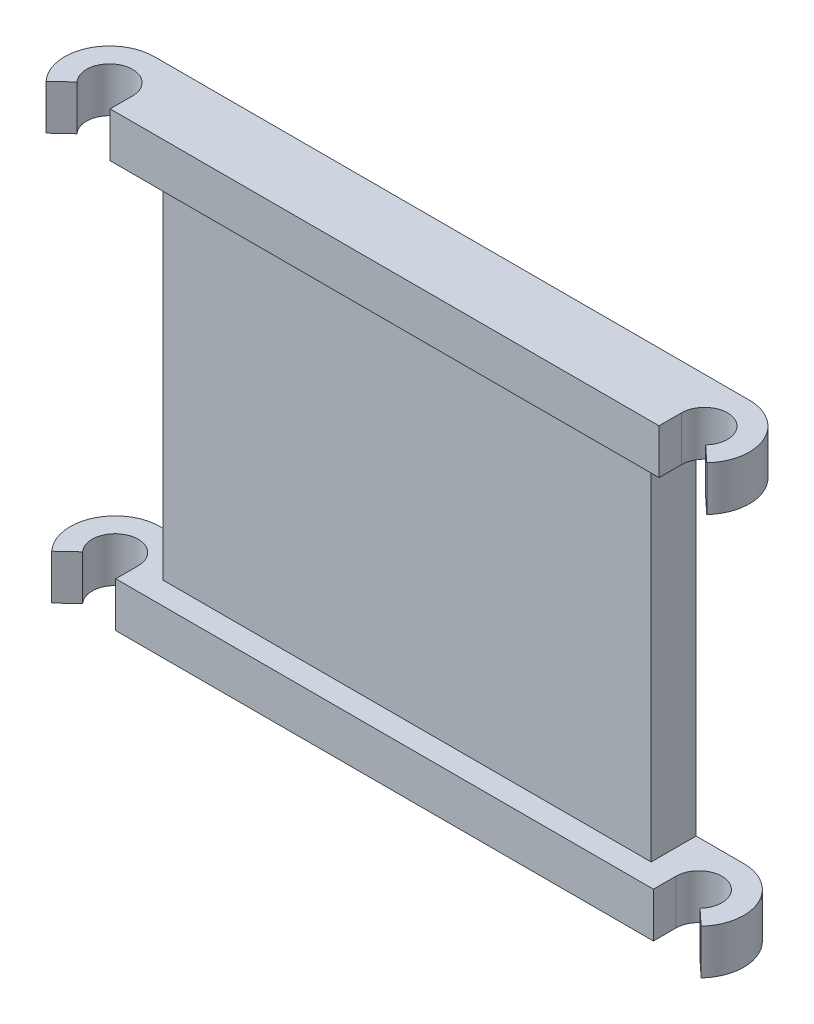
ISO-10303-21;
HEADER;
FILE_DESCRIPTION(('STEP AP214'),'2;1');
FILE_NAME('part.step','',(''),(''),'','','');
FILE_SCHEMA(('AUTOMOTIVE_DESIGN { 1 0 10303 214 1 1 1 1 }'));
ENDSEC;
DATA;
#1=APPLICATION_CONTEXT('core data for automotive mechanical design processes');
#2=APPLICATION_PROTOCOL_DEFINITION('international standard','automotive_design',2000,#1);
#3=PRODUCT_CONTEXT('',#1,'mechanical');
#4=PRODUCT('Part','Part','',(#3));
#5=PRODUCT_RELATED_PRODUCT_CATEGORY('part','',(#4));
#6=PRODUCT_DEFINITION_FORMATION('','',#4);
#7=PRODUCT_DEFINITION_CONTEXT('part definition',#1,'design');
#8=PRODUCT_DEFINITION('design','',#6,#7);
#9=PRODUCT_DEFINITION_SHAPE('','',#8);
#10=(LENGTH_UNIT() NAMED_UNIT(*) SI_UNIT(.MILLI.,.METRE.));
#11=(NAMED_UNIT(*) PLANE_ANGLE_UNIT() SI_UNIT($,.RADIAN.));
#12=(NAMED_UNIT(*) SI_UNIT($,.STERADIAN.) SOLID_ANGLE_UNIT());
#13=UNCERTAINTY_MEASURE_WITH_UNIT(LENGTH_MEASURE(1.E-05),#10,'distance_accuracy_value','');
#14=(GEOMETRIC_REPRESENTATION_CONTEXT(3) GLOBAL_UNCERTAINTY_ASSIGNED_CONTEXT((#13)) GLOBAL_UNIT_ASSIGNED_CONTEXT((#10,
#11,#12)) REPRESENTATION_CONTEXT('',''));
#15=CARTESIAN_POINT('',(0.,0.,0.));
#16=DIRECTION('',(0.,0.,1.));
#17=DIRECTION('',(1.,0.,0.));
#18=AXIS2_PLACEMENT_3D('',#15,#16,#17);
#19=CARTESIAN_POINT('',(52.,-32.,0.));
#20=DIRECTION('',(0.,-1.,0.));
#21=DIRECTION('',(0.,0.,-1.));
#22=AXIS2_PLACEMENT_3D('',#19,#20,#21);
#23=PLANE('',#22);
#24=DIRECTION('',(0.,0.,-1.));
#25=VECTOR('',#24,1.);
#26=CARTESIAN_POINT('',(43.5,-32.,0.));
#27=LINE('',#26,#25);
#28=CARTESIAN_POINT('',(43.5,-32.,0.));
#29=VERTEX_POINT('',#28);
#30=CARTESIAN_POINT('',(43.5,-32.,-8.));
#31=VERTEX_POINT('',#30);
#32=EDGE_CURVE('E338',#29,#31,#27,.T.);
#33=ORIENTED_EDGE('',*,*,#32,.F.);
#34=DIRECTION('',(-1.,0.,0.));
#35=VECTOR('',#34,1.);
#36=CARTESIAN_POINT('',(0.,-32.,0.));
#37=LINE('',#36,#35);
#38=CARTESIAN_POINT('',(-43.5,-32.,0.));
#39=VERTEX_POINT('',#38);
#40=EDGE_CURVE('E333',#29,#39,#37,.T.);
#41=ORIENTED_EDGE('',*,*,#40,.T.);
#42=DIRECTION('',(0.,0.,-1.));
#43=VECTOR('',#42,1.);
#44=CARTESIAN_POINT('',(-43.5,-32.,0.));
#45=LINE('',#44,#43);
#46=CARTESIAN_POINT('',(-43.5,-32.,-7.99999999999999));
#47=VERTEX_POINT('',#46);
#48=EDGE_CURVE('E243',#39,#47,#45,.T.);
#49=ORIENTED_EDGE('',*,*,#48,.T.);
#50=DIRECTION('',(1.,0.,0.));
#51=VECTOR('',#50,1.);
#52=CARTESIAN_POINT('',(-52.,-32.,-7.99999999999999));
#53=LINE('',#52,#51);
#54=CARTESIAN_POINT('',(-52.,-32.,-7.99999999999999));
#55=VERTEX_POINT('',#54);
#56=EDGE_CURVE('E256',#55,#47,#53,.T.);
#57=ORIENTED_EDGE('',*,*,#56,.F.);
#58=CARTESIAN_POINT('',(-52.,-32.,0.));
#59=DIRECTION('',(0.,-1.,0.));
#60=DIRECTION('',(0.,0.,1.));
#61=AXIS2_PLACEMENT_3D('',#58,#59,#60);
#62=CIRCLE('',#61,8.);
#63=CARTESIAN_POINT('',(-57.8536585365854,-32.,5.45295165365156));
#64=VERTEX_POINT('',#63);
#65=EDGE_CURVE('E253',#64,#55,#62,.T.);
#66=ORIENTED_EDGE('',*,*,#65,.F.);
#67=DIRECTION('',(-0.731707317073171,0.,0.681618956706444));
#68=VECTOR('',#67,1.);
#69=CARTESIAN_POINT('',(-55.,-32.,2.79463772249643));
#70=LINE('',#69,#68);
#71=CARTESIAN_POINT('',(-55.,-32.,2.79463772249643));
#72=VERTEX_POINT('',#71);
#73=EDGE_CURVE('E250',#72,#64,#70,.T.);
#74=ORIENTED_EDGE('',*,*,#73,.F.);
#75=CARTESIAN_POINT('',(-52.,-32.,0.));
#76=DIRECTION('',(0.,1.,0.));
#77=DIRECTION('',(0.,0.,-1.));
#78=AXIS2_PLACEMENT_3D('',#75,#76,#77);
#79=CIRCLE('',#78,4.1);
#80=CARTESIAN_POINT('',(-47.9,-32.,0.));
#81=VERTEX_POINT('',#80);
#82=EDGE_CURVE('E246',#81,#72,#79,.T.);
#83=ORIENTED_EDGE('',*,*,#82,.F.);
#84=DIRECTION('',(0.,0.,-1.));
#85=VECTOR('',#84,1.);
#86=CARTESIAN_POINT('',(-47.9,-32.,4.00000000000001));
#87=LINE('',#86,#85);
#88=CARTESIAN_POINT('',(-47.9,-32.,4.00000000000001));
#89=VERTEX_POINT('',#88);
#90=EDGE_CURVE('E259',#89,#81,#87,.T.);
#91=ORIENTED_EDGE('',*,*,#90,.F.);
#92=DIRECTION('',(1.,0.,0.));
#93=VECTOR('',#92,1.);
#94=CARTESIAN_POINT('',(0.,-32.,4.));
#95=LINE('',#94,#93);
#96=CARTESIAN_POINT('',(47.9,-32.,4.));
#97=VERTEX_POINT('',#96);
#98=EDGE_CURVE('E354',#89,#97,#95,.T.);
#99=ORIENTED_EDGE('',*,*,#98,.T.);
#100=DIRECTION('',(0.,0.,-1.));
#101=VECTOR('',#100,1.);
#102=CARTESIAN_POINT('',(47.9,-32.,4.));
#103=LINE('',#102,#101);
#104=CARTESIAN_POINT('',(47.9,-32.,0.));
#105=VERTEX_POINT('',#104);
#106=EDGE_CURVE('E357',#97,#105,#103,.T.);
#107=ORIENTED_EDGE('',*,*,#106,.T.);
#108=CARTESIAN_POINT('',(52.,-32.,0.));
#109=DIRECTION('',(0.,-1.,0.));
#110=DIRECTION('',(0.,0.,-1.));
#111=AXIS2_PLACEMENT_3D('',#108,#109,#110);
#112=CIRCLE('',#111,4.1);
#113=CARTESIAN_POINT('',(55.,-32.,2.79463772249642));
#114=VERTEX_POINT('',#113);
#115=EDGE_CURVE('E340',#105,#114,#112,.T.);
#116=ORIENTED_EDGE('',*,*,#115,.T.);
#117=DIRECTION('',(0.731707317073171,0.,0.681618956706444));
#118=VECTOR('',#117,1.);
#119=CARTESIAN_POINT('',(55.,-32.,2.79463772249642));
#120=LINE('',#119,#118);
#121=CARTESIAN_POINT('',(57.8536585365854,-32.,5.45295165365155));
#122=VERTEX_POINT('',#121);
#123=EDGE_CURVE('E345',#114,#122,#120,.T.);
#124=ORIENTED_EDGE('',*,*,#123,.T.);
#125=CARTESIAN_POINT('',(52.,-32.,0.));
#126=DIRECTION('',(0.,1.,0.));
#127=DIRECTION('',(0.,0.,1.));
#128=AXIS2_PLACEMENT_3D('',#125,#126,#127);
#129=CIRCLE('',#128,8.);
#130=CARTESIAN_POINT('',(52.,-32.,-8.));
#131=VERTEX_POINT('',#130);
#132=EDGE_CURVE('E348',#122,#131,#129,.T.);
#133=ORIENTED_EDGE('',*,*,#132,.T.);
#134=DIRECTION('',(-1.,0.,0.));
#135=VECTOR('',#134,1.);
#136=CARTESIAN_POINT('',(52.,-32.,-8.));
#137=LINE('',#136,#135);
#138=EDGE_CURVE('E351',#131,#31,#137,.T.);
#139=ORIENTED_EDGE('',*,*,#138,.T.);
#140=EDGE_LOOP('',(#33,#41,#49,#57,#66,#74,#83,#91,#99,#107,#116,#124,#133,#139));
#141=FACE_BOUND('',#140,.T.);
#142=ADVANCED_FACE('F41',(#141),#23,.F.);
#143=CARTESIAN_POINT('',(52.,-40.,0.));
#144=DIRECTION('',(0.,1.,0.));
#145=DIRECTION('',(0.,0.,1.));
#146=AXIS2_PLACEMENT_3D('',#143,#144,#145);
#147=CYLINDRICAL_SURFACE('',#146,4.1);
#148=DIRECTION('',(0.,1.,0.));
#149=VECTOR('',#148,1.);
#150=CARTESIAN_POINT('',(55.,-40.,2.79463772249642));
#151=LINE('',#150,#149);
#152=CARTESIAN_POINT('',(55.,-40.,2.79463772249642));
#153=VERTEX_POINT('',#152);
#154=EDGE_CURVE('E45',#153,#114,#151,.T.);
#155=ORIENTED_EDGE('',*,*,#154,.T.);
#156=ORIENTED_EDGE('',*,*,#115,.F.);
#157=DIRECTION('',(0.,1.,0.));
#158=VECTOR('',#157,1.);
#159=CARTESIAN_POINT('',(47.9,-40.,0.));
#160=LINE('',#159,#158);
#161=CARTESIAN_POINT('',(47.9,-40.,0.));
#162=VERTEX_POINT('',#161);
#163=EDGE_CURVE('E11',#162,#105,#160,.T.);
#164=ORIENTED_EDGE('',*,*,#163,.F.);
#165=CARTESIAN_POINT('',(52.,-40.,0.));
#166=DIRECTION('',(0.,-1.,0.));
#167=DIRECTION('',(0.,0.,-1.));
#168=AXIS2_PLACEMENT_3D('',#165,#166,#167);
#169=CIRCLE('',#168,4.1);
#170=EDGE_CURVE('E360',#162,#153,#169,.T.);
#171=ORIENTED_EDGE('',*,*,#170,.T.);
#172=EDGE_LOOP('',(#155,#156,#164,#171));
#173=FACE_BOUND('',#172,.T.);
#174=ADVANCED_FACE('F43',(#173),#147,.F.);
#175=CARTESIAN_POINT('',(47.9,-40.,4.));
#176=DIRECTION('',(1.,0.,0.));
#177=DIRECTION('',(0.,0.,-1.));
#178=AXIS2_PLACEMENT_3D('',#175,#176,#177);
#179=PLANE('',#178);
#180=ORIENTED_EDGE('',*,*,#163,.T.);
#181=ORIENTED_EDGE('',*,*,#106,.F.);
#182=DIRECTION('',(0.,1.,0.));
#183=VECTOR('',#182,1.);
#184=CARTESIAN_POINT('',(47.9,-40.,4.));
#185=LINE('',#184,#183);
#186=CARTESIAN_POINT('',(47.9,-40.,4.));
#187=VERTEX_POINT('',#186);
#188=EDGE_CURVE('E50',#187,#97,#185,.T.);
#189=ORIENTED_EDGE('',*,*,#188,.F.);
#190=DIRECTION('',(0.,0.,-1.));
#191=VECTOR('',#190,1.);
#192=CARTESIAN_POINT('',(47.9,-40.,4.));
#193=LINE('',#192,#191);
#194=EDGE_CURVE('E372',#187,#162,#193,.T.);
#195=ORIENTED_EDGE('',*,*,#194,.T.);
#196=EDGE_LOOP('',(#180,#181,#189,#195));
#197=FACE_BOUND('',#196,.T.);
#198=ADVANCED_FACE('F385',(#197),#179,.T.);
#199=CARTESIAN_POINT('',(0.,-40.,4.));
#200=DIRECTION('',(0.,0.,1.));
#201=DIRECTION('',(1.,0.,0.));
#202=AXIS2_PLACEMENT_3D('',#199,#200,#201);
#203=PLANE('',#202);
#204=ORIENTED_EDGE('',*,*,#188,.T.);
#205=ORIENTED_EDGE('',*,*,#98,.F.);
#206=DIRECTION('',(0.,1.,0.));
#207=VECTOR('',#206,1.);
#208=CARTESIAN_POINT('',(-47.9,-40.,4.00000000000001));
#209=LINE('',#208,#207);
#210=CARTESIAN_POINT('',(-47.9,-40.,4.00000000000001));
#211=VERTEX_POINT('',#210);
#212=EDGE_CURVE('E276',#211,#89,#209,.T.);
#213=ORIENTED_EDGE('',*,*,#212,.F.);
#214=DIRECTION('',(1.,0.,0.));
#215=VECTOR('',#214,1.);
#216=CARTESIAN_POINT('',(0.,-40.,4.));
#217=LINE('',#216,#215);
#218=EDGE_CURVE('E370',#211,#187,#217,.T.);
#219=ORIENTED_EDGE('',*,*,#218,.T.);
#220=EDGE_LOOP('',(#204,#205,#213,#219));
#221=FACE_BOUND('',#220,.T.);
#222=ADVANCED_FACE('F435',(#221),#203,.T.);
#223=CARTESIAN_POINT('',(52.,-40.,-8.));
#224=DIRECTION('',(0.,0.,-1.));
#225=DIRECTION('',(-1.,0.,0.));
#226=AXIS2_PLACEMENT_3D('',#223,#224,#225);
#227=PLANE('',#226);
#228=DIRECTION('',(-1.,0.,0.));
#229=VECTOR('',#228,1.);
#230=CARTESIAN_POINT('',(52.,-40.,-8.));
#231=LINE('',#230,#229);
#232=CARTESIAN_POINT('',(52.,-40.,-8.));
#233=VERTEX_POINT('',#232);
#234=CARTESIAN_POINT('',(-52.,-40.,-7.99999999999999));
#235=VERTEX_POINT('',#234);
#236=EDGE_CURVE('E368',#233,#235,#231,.T.);
#237=ORIENTED_EDGE('',*,*,#236,.T.);
#238=DIRECTION('',(0.,1.,0.));
#239=VECTOR('',#238,1.);
#240=CARTESIAN_POINT('',(-52.,-40.,-7.99999999999999));
#241=LINE('',#240,#239);
#242=EDGE_CURVE('E279',#235,#55,#241,.T.);
#243=ORIENTED_EDGE('',*,*,#242,.T.);
#244=ORIENTED_EDGE('',*,*,#56,.T.);
#245=DIRECTION('',(0.,-1.,0.));
#246=VECTOR('',#245,1.);
#247=CARTESIAN_POINT('',(-43.5,-32.,-7.99999999999999));
#248=LINE('',#247,#246);
#249=CARTESIAN_POINT('',(-43.5,32.,-7.99999999999999));
#250=VERTEX_POINT('',#249);
#251=EDGE_CURVE('E241',#250,#47,#248,.T.);
#252=ORIENTED_EDGE('',*,*,#251,.F.);
#253=DIRECTION('',(1.,0.,0.));
#254=VECTOR('',#253,1.);
#255=CARTESIAN_POINT('',(-53.,32.,-7.99999999999999));
#256=LINE('',#255,#254);
#257=CARTESIAN_POINT('',(-53.,32.,-7.99999999999999));
#258=VERTEX_POINT('',#257);
#259=EDGE_CURVE('E233',#258,#250,#256,.T.);
#260=ORIENTED_EDGE('',*,*,#259,.F.);
#261=DIRECTION('',(0.,1.,0.));
#262=VECTOR('',#261,1.);
#263=CARTESIAN_POINT('',(-53.,32.,-7.99999999999999));
#264=LINE('',#263,#262);
#265=CARTESIAN_POINT('',(-53.,40.,-7.99999999999999));
#266=VERTEX_POINT('',#265);
#267=EDGE_CURVE('E231',#258,#266,#264,.T.);
#268=ORIENTED_EDGE('',*,*,#267,.T.);
#269=DIRECTION('',(-1.,0.,0.));
#270=VECTOR('',#269,1.);
#271=CARTESIAN_POINT('',(53.,40.,-8.));
#272=LINE('',#271,#270);
#273=CARTESIAN_POINT('',(53.,40.,-8.));
#274=VERTEX_POINT('',#273);
#275=EDGE_CURVE('E291',#274,#266,#272,.T.);
#276=ORIENTED_EDGE('',*,*,#275,.F.);
#277=DIRECTION('',(0.,1.,0.));
#278=VECTOR('',#277,1.);
#279=CARTESIAN_POINT('',(53.,32.,-8.));
#280=LINE('',#279,#278);
#281=CARTESIAN_POINT('',(53.,32.,-8.));
#282=VERTEX_POINT('',#281);
#283=EDGE_CURVE('E323',#282,#274,#280,.T.);
#284=ORIENTED_EDGE('',*,*,#283,.F.);
#285=DIRECTION('',(-1.,0.,0.));
#286=VECTOR('',#285,1.);
#287=CARTESIAN_POINT('',(53.,32.,-8.));
#288=LINE('',#287,#286);
#289=CARTESIAN_POINT('',(43.5,32.,-8.));
#290=VERTEX_POINT('',#289);
#291=EDGE_CURVE('E308',#282,#290,#288,.T.);
#292=ORIENTED_EDGE('',*,*,#291,.T.);
#293=DIRECTION('',(0.,-1.,0.));
#294=VECTOR('',#293,1.);
#295=CARTESIAN_POINT('',(43.5,-32.,-8.));
#296=LINE('',#295,#294);
#297=EDGE_CURVE('E320',#290,#31,#296,.T.);
#298=ORIENTED_EDGE('',*,*,#297,.T.);
#299=ORIENTED_EDGE('',*,*,#138,.F.);
#300=DIRECTION('',(0.,1.,0.));
#301=VECTOR('',#300,1.);
#302=CARTESIAN_POINT('',(52.,-40.,-8.));
#303=LINE('',#302,#301);
#304=EDGE_CURVE('E375',#233,#131,#303,.T.);
#305=ORIENTED_EDGE('',*,*,#304,.F.);
#306=EDGE_LOOP('',(#237,#243,#244,#252,#260,#268,#276,#284,#292,#298,#299,#305));
#307=FACE_BOUND('',#306,.T.);
#308=ADVANCED_FACE('F396',(#307),#227,.T.);
#309=CARTESIAN_POINT('',(52.,-40.,0.));
#310=DIRECTION('',(0.,1.,0.));
#311=DIRECTION('',(0.,0.,1.));
#312=AXIS2_PLACEMENT_3D('',#309,#310,#311);
#313=CYLINDRICAL_SURFACE('',#312,8.);
#314=ORIENTED_EDGE('',*,*,#304,.T.);
#315=ORIENTED_EDGE('',*,*,#132,.F.);
#316=DIRECTION('',(0.,1.,0.));
#317=VECTOR('',#316,1.);
#318=CARTESIAN_POINT('',(57.8536585365854,-40.,5.45295165365155));
#319=LINE('',#318,#317);
#320=CARTESIAN_POINT('',(57.8536585365854,-40.,5.45295165365155));
#321=VERTEX_POINT('',#320);
#322=EDGE_CURVE('E376',#321,#122,#319,.T.);
#323=ORIENTED_EDGE('',*,*,#322,.F.);
#324=CARTESIAN_POINT('',(52.,-40.,0.));
#325=DIRECTION('',(0.,1.,0.));
#326=DIRECTION('',(0.,0.,1.));
#327=AXIS2_PLACEMENT_3D('',#324,#325,#326);
#328=CIRCLE('',#327,8.);
#329=EDGE_CURVE('E365',#321,#233,#328,.T.);
#330=ORIENTED_EDGE('',*,*,#329,.T.);
#331=EDGE_LOOP('',(#314,#315,#323,#330));
#332=FACE_BOUND('',#331,.T.);
#333=ADVANCED_FACE('F393',(#332),#313,.T.);
#334=CARTESIAN_POINT('',(55.,-40.,2.79463772249642));
#335=DIRECTION('',(-0.681618956706444,0.,0.731707317073171));
#336=DIRECTION('',(0.731707317073171,0.,0.681618956706444));
#337=AXIS2_PLACEMENT_3D('',#334,#335,#336);
#338=PLANE('',#337);
#339=ORIENTED_EDGE('',*,*,#322,.T.);
#340=ORIENTED_EDGE('',*,*,#123,.F.);
#341=ORIENTED_EDGE('',*,*,#154,.F.);
#342=DIRECTION('',(0.731707317073171,0.,0.681618956706444));
#343=VECTOR('',#342,1.);
#344=CARTESIAN_POINT('',(55.,-40.,2.79463772249642));
#345=LINE('',#344,#343);
#346=EDGE_CURVE('E362',#153,#321,#345,.T.);
#347=ORIENTED_EDGE('',*,*,#346,.T.);
#348=EDGE_LOOP('',(#339,#340,#341,#347));
#349=FACE_BOUND('',#348,.T.);
#350=ADVANCED_FACE('F380',(#349),#338,.T.);
#351=CARTESIAN_POINT('',(52.,-40.,0.));
#352=DIRECTION('',(0.,-1.,0.));
#353=DIRECTION('',(0.,0.,-1.));
#354=AXIS2_PLACEMENT_3D('',#351,#352,#353);
#355=PLANE('',#354);
#356=ORIENTED_EDGE('',*,*,#170,.F.);
#357=ORIENTED_EDGE('',*,*,#194,.F.);
#358=ORIENTED_EDGE('',*,*,#218,.F.);
#359=DIRECTION('',(0.,0.,-1.));
#360=VECTOR('',#359,1.);
#361=CARTESIAN_POINT('',(-47.9,-40.,4.00000000000001));
#362=LINE('',#361,#360);
#363=CARTESIAN_POINT('',(-47.9,-40.,0.));
#364=VERTEX_POINT('',#363);
#365=EDGE_CURVE('E270',#211,#364,#362,.T.);
#366=ORIENTED_EDGE('',*,*,#365,.T.);
#367=CARTESIAN_POINT('',(-52.,-40.,0.));
#368=DIRECTION('',(0.,1.,0.));
#369=DIRECTION('',(0.,0.,-1.));
#370=AXIS2_PLACEMENT_3D('',#367,#368,#369);
#371=CIRCLE('',#370,4.1);
#372=CARTESIAN_POINT('',(-55.,-40.,2.79463772249643));
#373=VERTEX_POINT('',#372);
#374=EDGE_CURVE('E262',#364,#373,#371,.T.);
#375=ORIENTED_EDGE('',*,*,#374,.T.);
#376=DIRECTION('',(-0.731707317073171,0.,0.681618956706444));
#377=VECTOR('',#376,1.);
#378=CARTESIAN_POINT('',(-55.,-40.,2.79463772249643));
#379=LINE('',#378,#377);
#380=CARTESIAN_POINT('',(-57.8536585365854,-40.,5.45295165365156));
#381=VERTEX_POINT('',#380);
#382=EDGE_CURVE('E265',#373,#381,#379,.T.);
#383=ORIENTED_EDGE('',*,*,#382,.T.);
#384=CARTESIAN_POINT('',(-52.,-40.,0.));
#385=DIRECTION('',(0.,-1.,0.));
#386=DIRECTION('',(0.,0.,1.));
#387=AXIS2_PLACEMENT_3D('',#384,#385,#386);
#388=CIRCLE('',#387,8.);
#389=EDGE_CURVE('E267',#381,#235,#388,.T.);
#390=ORIENTED_EDGE('',*,*,#389,.T.);
#391=ORIENTED_EDGE('',*,*,#236,.F.);
#392=ORIENTED_EDGE('',*,*,#329,.F.);
#393=ORIENTED_EDGE('',*,*,#346,.F.);
#394=EDGE_LOOP('',(#356,#357,#358,#366,#375,#383,#390,#391,#392,#393));
#395=FACE_BOUND('',#394,.T.);
#396=ADVANCED_FACE('F388',(#395),#355,.T.);
#397=CARTESIAN_POINT('',(43.5,-32.,0.));
#398=DIRECTION('',(1.,0.,0.));
#399=DIRECTION('',(0.,0.,-1.));
#400=AXIS2_PLACEMENT_3D('',#397,#398,#399);
#401=PLANE('',#400);
#402=ORIENTED_EDGE('',*,*,#297,.F.);
#403=DIRECTION('',(0.,0.,-1.));
#404=VECTOR('',#403,1.);
#405=CARTESIAN_POINT('',(43.5,32.,0.));
#406=LINE('',#405,#404);
#407=CARTESIAN_POINT('',(43.5,32.,0.));
#408=VERTEX_POINT('',#407);
#409=EDGE_CURVE('E335',#408,#290,#406,.T.);
#410=ORIENTED_EDGE('',*,*,#409,.F.);
#411=DIRECTION('',(0.,-1.,0.));
#412=VECTOR('',#411,1.);
#413=CARTESIAN_POINT('',(43.5,-32.,0.));
#414=LINE('',#413,#412);
#415=EDGE_CURVE('E331',#408,#29,#414,.T.);
#416=ORIENTED_EDGE('',*,*,#415,.T.);
#417=ORIENTED_EDGE('',*,*,#32,.T.);
#418=EDGE_LOOP('',(#402,#410,#416,#417));
#419=FACE_BOUND('',#418,.T.);
#420=ADVANCED_FACE('F399',(#419),#401,.T.);
#421=CARTESIAN_POINT('',(0.,0.,0.));
#422=DIRECTION('',(0.,0.,1.));
#423=DIRECTION('',(1.,0.,0.));
#424=AXIS2_PLACEMENT_3D('',#421,#422,#423);
#425=PLANE('',#424);
#426=DIRECTION('',(1.,0.,0.));
#427=VECTOR('',#426,1.);
#428=CARTESIAN_POINT('',(43.5,32.,0.));
#429=LINE('',#428,#427);
#430=CARTESIAN_POINT('',(-43.5,32.,0.));
#431=VERTEX_POINT('',#430);
#432=EDGE_CURVE('E328',#431,#408,#429,.T.);
#433=ORIENTED_EDGE('',*,*,#432,.F.);
#434=DIRECTION('',(0.,-1.,0.));
#435=VECTOR('',#434,1.);
#436=CARTESIAN_POINT('',(-43.5,-32.,0.));
#437=LINE('',#436,#435);
#438=EDGE_CURVE('E237',#431,#39,#437,.T.);
#439=ORIENTED_EDGE('',*,*,#438,.T.);
#440=ORIENTED_EDGE('',*,*,#40,.F.);
#441=ORIENTED_EDGE('',*,*,#415,.F.);
#442=EDGE_LOOP('',(#433,#439,#440,#441));
#443=FACE_BOUND('',#442,.T.);
#444=ADVANCED_FACE('F408',(#443),#425,.T.);
#445=CARTESIAN_POINT('',(53.,32.,0.));
#446=DIRECTION('',(0.,1.,0.));
#447=DIRECTION('',(0.,0.,1.));
#448=AXIS2_PLACEMENT_3D('',#445,#446,#447);
#449=CYLINDRICAL_SURFACE('',#448,4.1);
#450=DIRECTION('',(0.,1.,0.));
#451=VECTOR('',#450,1.);
#452=CARTESIAN_POINT('',(56.,32.,2.79463772249642));
#453=LINE('',#452,#451);
#454=CARTESIAN_POINT('',(56.,32.,2.79463772249642));
#455=VERTEX_POINT('',#454);
#456=CARTESIAN_POINT('',(56.,40.,2.79463772249642));
#457=VERTEX_POINT('',#456);
#458=EDGE_CURVE('E317',#455,#457,#453,.T.);
#459=ORIENTED_EDGE('',*,*,#458,.T.);
#460=CARTESIAN_POINT('',(53.,40.,0.));
#461=DIRECTION('',(0.,-1.,0.));
#462=DIRECTION('',(0.,0.,-1.));
#463=AXIS2_PLACEMENT_3D('',#460,#461,#462);
#464=CIRCLE('',#463,4.1);
#465=CARTESIAN_POINT('',(48.9,40.,0.));
#466=VERTEX_POINT('',#465);
#467=EDGE_CURVE('E275',#466,#457,#464,.T.);
#468=ORIENTED_EDGE('',*,*,#467,.F.);
#469=DIRECTION('',(0.,1.,0.));
#470=VECTOR('',#469,1.);
#471=CARTESIAN_POINT('',(48.9,32.,0.));
#472=LINE('',#471,#470);
#473=CARTESIAN_POINT('',(48.9,32.,0.));
#474=VERTEX_POINT('',#473);
#475=EDGE_CURVE('E318',#474,#466,#472,.T.);
#476=ORIENTED_EDGE('',*,*,#475,.F.);
#477=CARTESIAN_POINT('',(53.,32.,0.));
#478=DIRECTION('',(0.,-1.,0.));
#479=DIRECTION('',(0.,0.,-1.));
#480=AXIS2_PLACEMENT_3D('',#477,#478,#479);
#481=CIRCLE('',#480,4.1);
#482=EDGE_CURVE('E299',#474,#455,#481,.T.);
#483=ORIENTED_EDGE('',*,*,#482,.T.);
#484=EDGE_LOOP('',(#459,#468,#476,#483));
#485=FACE_BOUND('',#484,.T.);
#486=ADVANCED_FACE('F505',(#485),#449,.F.);
#487=CARTESIAN_POINT('',(48.9,32.,0.));
#488=DIRECTION('',(1.,0.,0.));
#489=DIRECTION('',(0.,0.,-1.));
#490=AXIS2_PLACEMENT_3D('',#487,#488,#489);
#491=PLANE('',#490);
#492=ORIENTED_EDGE('',*,*,#475,.T.);
#493=DIRECTION('',(0.,0.,-1.));
#494=VECTOR('',#493,1.);
#495=CARTESIAN_POINT('',(48.9,40.,0.));
#496=LINE('',#495,#494);
#497=CARTESIAN_POINT('',(48.9,40.,4.));
#498=VERTEX_POINT('',#497);
#499=EDGE_CURVE('E296',#498,#466,#496,.T.);
#500=ORIENTED_EDGE('',*,*,#499,.F.);
#501=DIRECTION('',(0.,1.,0.));
#502=VECTOR('',#501,1.);
#503=CARTESIAN_POINT('',(48.9,32.,4.));
#504=LINE('',#503,#502);
#505=CARTESIAN_POINT('',(48.9,32.,4.));
#506=VERTEX_POINT('',#505);
#507=EDGE_CURVE('E321',#506,#498,#504,.T.);
#508=ORIENTED_EDGE('',*,*,#507,.F.);
#509=DIRECTION('',(0.,0.,-1.));
#510=VECTOR('',#509,1.);
#511=CARTESIAN_POINT('',(48.9,32.,0.));
#512=LINE('',#511,#510);
#513=EDGE_CURVE('E314',#506,#474,#512,.T.);
#514=ORIENTED_EDGE('',*,*,#513,.T.);
#515=EDGE_LOOP('',(#492,#500,#508,#514));
#516=FACE_BOUND('',#515,.T.);
#517=ADVANCED_FACE('F509',(#516),#491,.T.);
#518=CARTESIAN_POINT('',(0.,32.,4.));
#519=DIRECTION('',(0.,0.,1.));
#520=DIRECTION('',(1.,0.,0.));
#521=AXIS2_PLACEMENT_3D('',#518,#519,#520);
#522=PLANE('',#521);
#523=ORIENTED_EDGE('',*,*,#507,.T.);
#524=DIRECTION('',(1.,0.,0.));
#525=VECTOR('',#524,1.);
#526=CARTESIAN_POINT('',(0.,40.,4.));
#527=LINE('',#526,#525);
#528=CARTESIAN_POINT('',(-48.9,40.,4.00000000000001));
#529=VERTEX_POINT('',#528);
#530=EDGE_CURVE('E293',#529,#498,#527,.T.);
#531=ORIENTED_EDGE('',*,*,#530,.F.);
#532=DIRECTION('',(0.,1.,0.));
#533=VECTOR('',#532,1.);
#534=CARTESIAN_POINT('',(-48.9,32.,4.00000000000001));
#535=LINE('',#534,#533);
#536=CARTESIAN_POINT('',(-48.9,32.,4.00000000000001));
#537=VERTEX_POINT('',#536);
#538=EDGE_CURVE('E660',#537,#529,#535,.T.);
#539=ORIENTED_EDGE('',*,*,#538,.F.);
#540=DIRECTION('',(1.,0.,0.));
#541=VECTOR('',#540,1.);
#542=CARTESIAN_POINT('',(0.,32.,4.));
#543=LINE('',#542,#541);
#544=EDGE_CURVE('E311',#537,#506,#543,.T.);
#545=ORIENTED_EDGE('',*,*,#544,.T.);
#546=EDGE_LOOP('',(#523,#531,#539,#545));
#547=FACE_BOUND('',#546,.T.);
#548=ADVANCED_FACE('F519',(#547),#522,.T.);
#549=CARTESIAN_POINT('',(53.,32.,0.));
#550=DIRECTION('',(0.,1.,0.));
#551=DIRECTION('',(0.,0.,1.));
#552=AXIS2_PLACEMENT_3D('',#549,#550,#551);
#553=CYLINDRICAL_SURFACE('',#552,8.);
#554=ORIENTED_EDGE('',*,*,#283,.T.);
#555=CARTESIAN_POINT('',(53.,40.,0.));
#556=DIRECTION('',(0.,1.,0.));
#557=DIRECTION('',(0.,0.,-1.));
#558=AXIS2_PLACEMENT_3D('',#555,#556,#557);
#559=CIRCLE('',#558,8.);
#560=CARTESIAN_POINT('',(58.8536585365854,40.,5.45295165365155));
#561=VERTEX_POINT('',#560);
#562=EDGE_CURVE('E288',#561,#274,#559,.T.);
#563=ORIENTED_EDGE('',*,*,#562,.F.);
#564=DIRECTION('',(0.,1.,0.));
#565=VECTOR('',#564,1.);
#566=CARTESIAN_POINT('',(58.8536585365854,32.,5.45295165365155));
#567=LINE('',#566,#565);
#568=CARTESIAN_POINT('',(58.8536585365854,32.,5.45295165365155));
#569=VERTEX_POINT('',#568);
#570=EDGE_CURVE('E325',#569,#561,#567,.T.);
#571=ORIENTED_EDGE('',*,*,#570,.F.);
#572=CARTESIAN_POINT('',(53.,32.,0.));
#573=DIRECTION('',(0.,1.,0.));
#574=DIRECTION('',(0.,0.,-1.));
#575=AXIS2_PLACEMENT_3D('',#572,#573,#574);
#576=CIRCLE('',#575,8.);
#577=EDGE_CURVE('E305',#569,#282,#576,.T.);
#578=ORIENTED_EDGE('',*,*,#577,.T.);
#579=EDGE_LOOP('',(#554,#563,#571,#578));
#580=FACE_BOUND('',#579,.T.);
#581=ADVANCED_FACE('F530',(#580),#553,.T.);
#582=CARTESIAN_POINT('',(56.,32.,2.79463772249642));
#583=DIRECTION('',(-0.681618956706443,0.,0.731707317073172));
#584=DIRECTION('',(0.731707317073172,0.,0.681618956706443));
#585=AXIS2_PLACEMENT_3D('',#582,#583,#584);
#586=PLANE('',#585);
#587=ORIENTED_EDGE('',*,*,#570,.T.);
#588=DIRECTION('',(0.731707317073172,0.,0.681618956706443));
#589=VECTOR('',#588,1.);
#590=CARTESIAN_POINT('',(56.,40.,2.79463772249642));
#591=LINE('',#590,#589);
#592=EDGE_CURVE('E285',#457,#561,#591,.T.);
#593=ORIENTED_EDGE('',*,*,#592,.F.);
#594=ORIENTED_EDGE('',*,*,#458,.F.);
#595=DIRECTION('',(0.731707317073172,0.,0.681618956706443));
#596=VECTOR('',#595,1.);
#597=CARTESIAN_POINT('',(56.,32.,2.79463772249642));
#598=LINE('',#597,#596);
#599=EDGE_CURVE('E302',#455,#569,#598,.T.);
#600=ORIENTED_EDGE('',*,*,#599,.T.);
#601=EDGE_LOOP('',(#587,#593,#594,#600));
#602=FACE_BOUND('',#601,.T.);
#603=ADVANCED_FACE('F540',(#602),#586,.T.);
#604=CARTESIAN_POINT('',(53.,32.,0.));
#605=DIRECTION('',(0.,-1.,0.));
#606=DIRECTION('',(0.,0.,-1.));
#607=AXIS2_PLACEMENT_3D('',#604,#605,#606);
#608=PLANE('',#607);
#609=ORIENTED_EDGE('',*,*,#544,.F.);
#610=DIRECTION('',(0.,0.,-1.));
#611=VECTOR('',#610,1.);
#612=CARTESIAN_POINT('',(-48.9,32.,0.));
#613=LINE('',#612,#611);
#614=CARTESIAN_POINT('',(-48.9,32.,0.));
#615=VERTEX_POINT('',#614);
#616=EDGE_CURVE('E229',#537,#615,#613,.T.);
#617=ORIENTED_EDGE('',*,*,#616,.T.);
#618=CARTESIAN_POINT('',(-53.,32.,0.));
#619=DIRECTION('',(0.,1.,0.));
#620=DIRECTION('',(0.,0.,-1.));
#621=AXIS2_PLACEMENT_3D('',#618,#619,#620);
#622=CIRCLE('',#621,4.1);
#623=CARTESIAN_POINT('',(-56.,32.,2.79463772249643));
#624=VERTEX_POINT('',#623);
#625=EDGE_CURVE('E672',#615,#624,#622,.T.);
#626=ORIENTED_EDGE('',*,*,#625,.T.);
#627=DIRECTION('',(-0.731707317073172,0.,0.681618956706444));
#628=VECTOR('',#627,1.);
#629=CARTESIAN_POINT('',(-56.,32.,2.79463772249643));
#630=LINE('',#629,#628);
#631=CARTESIAN_POINT('',(-58.8536585365854,32.,5.45295165365156));
#632=VERTEX_POINT('',#631);
#633=EDGE_CURVE('E226',#624,#632,#630,.T.);
#634=ORIENTED_EDGE('',*,*,#633,.T.);
#635=CARTESIAN_POINT('',(-53.,32.,0.));
#636=DIRECTION('',(0.,-1.,0.));
#637=DIRECTION('',(0.,0.,-1.));
#638=AXIS2_PLACEMENT_3D('',#635,#636,#637);
#639=CIRCLE('',#638,8.);
#640=EDGE_CURVE('E658',#632,#258,#639,.T.);
#641=ORIENTED_EDGE('',*,*,#640,.T.);
#642=ORIENTED_EDGE('',*,*,#259,.T.);
#643=DIRECTION('',(0.,0.,-1.));
#644=VECTOR('',#643,1.);
#645=CARTESIAN_POINT('',(-43.5,32.,0.));
#646=LINE('',#645,#644);
#647=EDGE_CURVE('E240',#431,#250,#646,.T.);
#648=ORIENTED_EDGE('',*,*,#647,.F.);
#649=ORIENTED_EDGE('',*,*,#432,.T.);
#650=ORIENTED_EDGE('',*,*,#409,.T.);
#651=ORIENTED_EDGE('',*,*,#291,.F.);
#652=ORIENTED_EDGE('',*,*,#577,.F.);
#653=ORIENTED_EDGE('',*,*,#599,.F.);
#654=ORIENTED_EDGE('',*,*,#482,.F.);
#655=ORIENTED_EDGE('',*,*,#513,.F.);
#656=EDGE_LOOP('',(#609,#617,#626,#634,#641,#642,#648,#649,#650,#651,#652,#653,#654,#655));
#657=FACE_BOUND('',#656,.T.);
#658=ADVANCED_FACE('F402',(#657),#608,.T.);
#659=CARTESIAN_POINT('',(53.,40.,0.));
#660=DIRECTION('',(0.,-1.,0.));
#661=DIRECTION('',(0.,0.,-1.));
#662=AXIS2_PLACEMENT_3D('',#659,#660,#661);
#663=PLANE('',#662);
#664=ORIENTED_EDGE('',*,*,#467,.T.);
#665=ORIENTED_EDGE('',*,*,#592,.T.);
#666=ORIENTED_EDGE('',*,*,#562,.T.);
#667=ORIENTED_EDGE('',*,*,#275,.T.);
#668=CARTESIAN_POINT('',(-53.,40.,0.));
#669=DIRECTION('',(0.,-1.,0.));
#670=DIRECTION('',(0.,0.,-1.));
#671=AXIS2_PLACEMENT_3D('',#668,#669,#670);
#672=CIRCLE('',#671,8.);
#673=CARTESIAN_POINT('',(-58.8536585365854,40.,5.45295165365156));
#674=VERTEX_POINT('',#673);
#675=EDGE_CURVE('E211',#674,#266,#672,.T.);
#676=ORIENTED_EDGE('',*,*,#675,.F.);
#677=DIRECTION('',(-0.731707317073172,0.,0.681618956706444));
#678=VECTOR('',#677,1.);
#679=CARTESIAN_POINT('',(-56.,40.,2.79463772249643));
#680=LINE('',#679,#678);
#681=CARTESIAN_POINT('',(-56.,40.,2.79463772249643));
#682=VERTEX_POINT('',#681);
#683=EDGE_CURVE('E203',#682,#674,#680,.T.);
#684=ORIENTED_EDGE('',*,*,#683,.F.);
#685=CARTESIAN_POINT('',(-53.,40.,0.));
#686=DIRECTION('',(0.,1.,0.));
#687=DIRECTION('',(0.,0.,-1.));
#688=AXIS2_PLACEMENT_3D('',#685,#686,#687);
#689=CIRCLE('',#688,4.1);
#690=CARTESIAN_POINT('',(-48.9,40.,0.));
#691=VERTEX_POINT('',#690);
#692=EDGE_CURVE('E208',#691,#682,#689,.T.);
#693=ORIENTED_EDGE('',*,*,#692,.F.);
#694=DIRECTION('',(0.,0.,-1.));
#695=VECTOR('',#694,1.);
#696=CARTESIAN_POINT('',(-48.9,40.,0.));
#697=LINE('',#696,#695);
#698=EDGE_CURVE('E669',#529,#691,#697,.T.);
#699=ORIENTED_EDGE('',*,*,#698,.F.);
#700=ORIENTED_EDGE('',*,*,#530,.T.);
#701=ORIENTED_EDGE('',*,*,#499,.T.);
#702=EDGE_LOOP('',(#664,#665,#666,#667,#676,#684,#693,#699,#700,#701));
#703=FACE_BOUND('',#702,.T.);
#704=ADVANCED_FACE('F206',(#703),#663,.F.);
#705=CARTESIAN_POINT('',(-52.,-40.,0.));
#706=DIRECTION('',(0.,1.,0.));
#707=DIRECTION('',(0.,0.,1.));
#708=AXIS2_PLACEMENT_3D('',#705,#706,#707);
#709=CYLINDRICAL_SURFACE('',#708,4.1);
#710=DIRECTION('',(0.,1.,0.));
#711=VECTOR('',#710,1.);
#712=CARTESIAN_POINT('',(-55.,-40.,2.79463772249643));
#713=LINE('',#712,#711);
#714=EDGE_CURVE('E272',#373,#72,#713,.T.);
#715=ORIENTED_EDGE('',*,*,#714,.F.);
#716=ORIENTED_EDGE('',*,*,#374,.F.);
#717=DIRECTION('',(0.,1.,0.));
#718=VECTOR('',#717,1.);
#719=CARTESIAN_POINT('',(-47.9,-40.,0.));
#720=LINE('',#719,#718);
#721=EDGE_CURVE('E273',#364,#81,#720,.T.);
#722=ORIENTED_EDGE('',*,*,#721,.T.);
#723=ORIENTED_EDGE('',*,*,#82,.T.);
#724=EDGE_LOOP('',(#715,#716,#722,#723));
#725=FACE_BOUND('',#724,.T.);
#726=ADVANCED_FACE('F429',(#725),#709,.F.);
#727=CARTESIAN_POINT('',(-47.9,-40.,4.00000000000001));
#728=DIRECTION('',(-1.,0.,0.));
#729=DIRECTION('',(0.,0.,-1.));
#730=AXIS2_PLACEMENT_3D('',#727,#728,#729);
#731=PLANE('',#730);
#732=ORIENTED_EDGE('',*,*,#721,.F.);
#733=ORIENTED_EDGE('',*,*,#365,.F.);
#734=ORIENTED_EDGE('',*,*,#212,.T.);
#735=ORIENTED_EDGE('',*,*,#90,.T.);
#736=EDGE_LOOP('',(#732,#733,#734,#735));
#737=FACE_BOUND('',#736,.T.);
#738=ADVANCED_FACE('F433',(#737),#731,.T.);
#739=CARTESIAN_POINT('',(-52.,-40.,0.));
#740=DIRECTION('',(0.,1.,0.));
#741=DIRECTION('',(0.,0.,1.));
#742=AXIS2_PLACEMENT_3D('',#739,#740,#741);
#743=CYLINDRICAL_SURFACE('',#742,8.);
#744=ORIENTED_EDGE('',*,*,#242,.F.);
#745=ORIENTED_EDGE('',*,*,#389,.F.);
#746=DIRECTION('',(0.,1.,0.));
#747=VECTOR('',#746,1.);
#748=CARTESIAN_POINT('',(-57.8536585365854,-40.,5.45295165365156));
#749=LINE('',#748,#747);
#750=EDGE_CURVE('E281',#381,#64,#749,.T.);
#751=ORIENTED_EDGE('',*,*,#750,.T.);
#752=ORIENTED_EDGE('',*,*,#65,.T.);
#753=EDGE_LOOP('',(#744,#745,#751,#752));
#754=FACE_BOUND('',#753,.T.);
#755=ADVANCED_FACE('F420',(#754),#743,.T.);
#756=CARTESIAN_POINT('',(-55.,-40.,2.79463772249643));
#757=DIRECTION('',(0.681618956706444,0.,0.731707317073171));
#758=DIRECTION('',(-0.731707317073171,0.,0.681618956706444));
#759=AXIS2_PLACEMENT_3D('',#756,#757,#758);
#760=PLANE('',#759);
#761=ORIENTED_EDGE('',*,*,#750,.F.);
#762=ORIENTED_EDGE('',*,*,#382,.F.);
#763=ORIENTED_EDGE('',*,*,#714,.T.);
#764=ORIENTED_EDGE('',*,*,#73,.T.);
#765=EDGE_LOOP('',(#761,#762,#763,#764));
#766=FACE_BOUND('',#765,.T.);
#767=ADVANCED_FACE('F425',(#766),#760,.T.);
#768=CARTESIAN_POINT('',(-43.5,-32.,0.));
#769=DIRECTION('',(-1.,0.,0.));
#770=DIRECTION('',(0.,0.,-1.));
#771=AXIS2_PLACEMENT_3D('',#768,#769,#770);
#772=PLANE('',#771);
#773=ORIENTED_EDGE('',*,*,#251,.T.);
#774=ORIENTED_EDGE('',*,*,#48,.F.);
#775=ORIENTED_EDGE('',*,*,#438,.F.);
#776=ORIENTED_EDGE('',*,*,#647,.T.);
#777=EDGE_LOOP('',(#773,#774,#775,#776));
#778=FACE_BOUND('',#777,.T.);
#779=ADVANCED_FACE('F414',(#778),#772,.T.);
#780=CARTESIAN_POINT('',(-53.,32.,0.));
#781=DIRECTION('',(0.,1.,0.));
#782=DIRECTION('',(0.,0.,1.));
#783=AXIS2_PLACEMENT_3D('',#780,#781,#782);
#784=CYLINDRICAL_SURFACE('',#783,4.1);
#785=DIRECTION('',(0.,1.,0.));
#786=VECTOR('',#785,1.);
#787=CARTESIAN_POINT('',(-56.,32.,2.79463772249643));
#788=LINE('',#787,#786);
#789=EDGE_CURVE('E221',#624,#682,#788,.T.);
#790=ORIENTED_EDGE('',*,*,#789,.F.);
#791=ORIENTED_EDGE('',*,*,#625,.F.);
#792=DIRECTION('',(0.,1.,0.));
#793=VECTOR('',#792,1.);
#794=CARTESIAN_POINT('',(-48.9,32.,0.));
#795=LINE('',#794,#793);
#796=EDGE_CURVE('E223',#615,#691,#795,.T.);
#797=ORIENTED_EDGE('',*,*,#796,.T.);
#798=ORIENTED_EDGE('',*,*,#692,.T.);
#799=EDGE_LOOP('',(#790,#791,#797,#798));
#800=FACE_BOUND('',#799,.T.);
#801=ADVANCED_FACE('F219',(#800),#784,.F.);
#802=CARTESIAN_POINT('',(-48.9,32.,0.));
#803=DIRECTION('',(-1.,0.,0.));
#804=DIRECTION('',(0.,0.,-1.));
#805=AXIS2_PLACEMENT_3D('',#802,#803,#804);
#806=PLANE('',#805);
#807=ORIENTED_EDGE('',*,*,#796,.F.);
#808=ORIENTED_EDGE('',*,*,#616,.F.);
#809=ORIENTED_EDGE('',*,*,#538,.T.);
#810=ORIENTED_EDGE('',*,*,#698,.T.);
#811=EDGE_LOOP('',(#807,#808,#809,#810));
#812=FACE_BOUND('',#811,.T.);
#813=ADVANCED_FACE('F619',(#812),#806,.T.);
#814=CARTESIAN_POINT('',(-53.,32.,0.));
#815=DIRECTION('',(0.,1.,0.));
#816=DIRECTION('',(0.,0.,1.));
#817=AXIS2_PLACEMENT_3D('',#814,#815,#816);
#818=CYLINDRICAL_SURFACE('',#817,8.);
#819=ORIENTED_EDGE('',*,*,#267,.F.);
#820=ORIENTED_EDGE('',*,*,#640,.F.);
#821=DIRECTION('',(0.,1.,0.));
#822=VECTOR('',#821,1.);
#823=CARTESIAN_POINT('',(-58.8536585365854,32.,5.45295165365156));
#824=LINE('',#823,#822);
#825=EDGE_CURVE('E228',#632,#674,#824,.T.);
#826=ORIENTED_EDGE('',*,*,#825,.T.);
#827=ORIENTED_EDGE('',*,*,#675,.T.);
#828=EDGE_LOOP('',(#819,#820,#826,#827));
#829=FACE_BOUND('',#828,.T.);
#830=ADVANCED_FACE('F627',(#829),#818,.T.);
#831=CARTESIAN_POINT('',(-56.,32.,2.79463772249643));
#832=DIRECTION('',(0.681618956706444,0.,0.731707317073172));
#833=DIRECTION('',(-0.731707317073172,0.,0.681618956706444));
#834=AXIS2_PLACEMENT_3D('',#831,#832,#833);
#835=PLANE('',#834);
#836=ORIENTED_EDGE('',*,*,#825,.F.);
#837=ORIENTED_EDGE('',*,*,#633,.F.);
#838=ORIENTED_EDGE('',*,*,#789,.T.);
#839=ORIENTED_EDGE('',*,*,#683,.T.);
#840=EDGE_LOOP('',(#836,#837,#838,#839));
#841=FACE_BOUND('',#840,.T.);
#842=ADVANCED_FACE('F225',(#841),#835,.T.);
#843=CLOSED_SHELL('',(#142,#174,#198,#222,#308,#333,#350,#396,#420,#444,#486,#517,#548,#581,
#603,#658,#704,#726,#738,#755,#767,#779,#801,#813,#830,#842));
#844=MANIFOLD_SOLID_BREP('B2',#843);
#845=ADVANCED_BREP_SHAPE_REPRESENTATION('',(#18,#844),#14);
#846=SHAPE_DEFINITION_REPRESENTATION(#9,#845);
ENDSEC;
END-ISO-10303-21;
